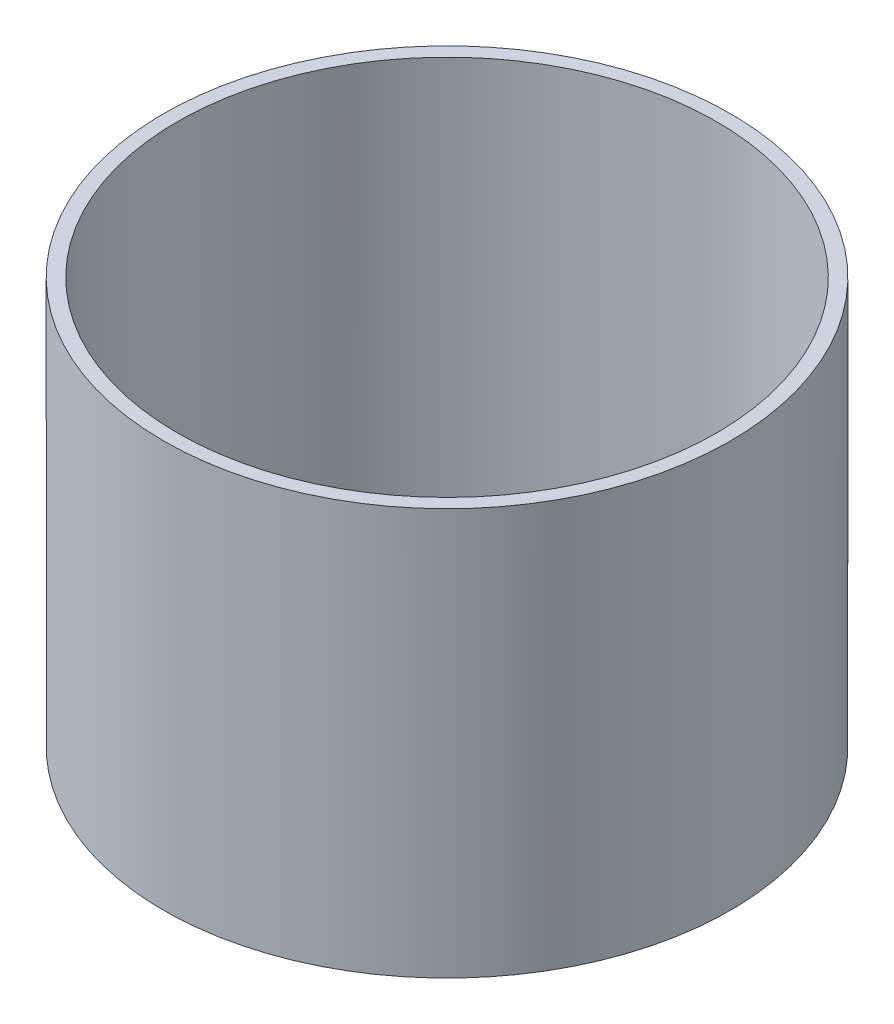
ISO-10303-21;
HEADER;
FILE_DESCRIPTION(('STEP AP214'),'2;1');
FILE_NAME('part.step','',(''),(''),'','','');
FILE_SCHEMA(('AUTOMOTIVE_DESIGN { 1 0 10303 214 1 1 1 1 }'));
ENDSEC;
DATA;
#1=APPLICATION_CONTEXT('core data for automotive mechanical design processes');
#2=APPLICATION_PROTOCOL_DEFINITION('international standard','automotive_design',2000,#1);
#3=PRODUCT_CONTEXT('',#1,'mechanical');
#4=PRODUCT('Part','Part','',(#3));
#5=PRODUCT_RELATED_PRODUCT_CATEGORY('part','',(#4));
#6=PRODUCT_DEFINITION_FORMATION('','',#4);
#7=PRODUCT_DEFINITION_CONTEXT('part definition',#1,'design');
#8=PRODUCT_DEFINITION('design','',#6,#7);
#9=PRODUCT_DEFINITION_SHAPE('','',#8);
#10=(LENGTH_UNIT() NAMED_UNIT(*) SI_UNIT(.MILLI.,.METRE.));
#11=(NAMED_UNIT(*) PLANE_ANGLE_UNIT() SI_UNIT($,.RADIAN.));
#12=(NAMED_UNIT(*) SI_UNIT($,.STERADIAN.) SOLID_ANGLE_UNIT());
#13=UNCERTAINTY_MEASURE_WITH_UNIT(LENGTH_MEASURE(1.E-05),#10,'distance_accuracy_value','');
#14=(GEOMETRIC_REPRESENTATION_CONTEXT(3) GLOBAL_UNCERTAINTY_ASSIGNED_CONTEXT((#13)) GLOBAL_UNIT_ASSIGNED_CONTEXT((#10,
#11,#12)) REPRESENTATION_CONTEXT('',''));
#15=CARTESIAN_POINT('',(0.,0.,0.));
#16=DIRECTION('',(0.,0.,1.));
#17=DIRECTION('',(1.,0.,0.));
#18=AXIS2_PLACEMENT_3D('',#15,#16,#17);
#19=CARTESIAN_POINT('',(0.,58.8,0.));
#20=DIRECTION('',(0.,1.,0.));
#21=DIRECTION('',(0.,0.,1.));
#22=AXIS2_PLACEMENT_3D('',#19,#20,#21);
#23=PLANE('',#22);
#24=CARTESIAN_POINT('',(0.,58.8,0.));
#25=DIRECTION('',(0.,1.,0.));
#26=DIRECTION('',(0.,0.,1.));
#27=AXIS2_PLACEMENT_3D('',#24,#25,#26);
#28=CIRCLE('',#27,41.);
#29=CARTESIAN_POINT('',(0.,58.8,41.));
#30=VERTEX_POINT('',#29);
#31=EDGE_CURVE('E48',#30,#30,#28,.T.);
#32=ORIENTED_EDGE('',*,*,#31,.T.);
#33=EDGE_LOOP('',(#32));
#34=FACE_BOUND('',#33,.T.);
#35=CARTESIAN_POINT('',(0.,58.8,0.));
#36=DIRECTION('',(0.,1.,0.));
#37=DIRECTION('',(0.,0.,1.));
#38=AXIS2_PLACEMENT_3D('',#35,#36,#37);
#39=CIRCLE('',#38,39.);
#40=CARTESIAN_POINT('',(0.,58.8,39.));
#41=VERTEX_POINT('',#40);
#42=EDGE_CURVE('E79',#41,#41,#39,.T.);
#43=ORIENTED_EDGE('',*,*,#42,.F.);
#44=EDGE_LOOP('',(#43));
#45=FACE_BOUND('',#44,.T.);
#46=ADVANCED_FACE('F33',(#34,#45),#23,.T.);
#47=CARTESIAN_POINT('',(0.,0.,0.));
#48=DIRECTION('',(0.,1.,0.));
#49=DIRECTION('',(0.,0.,1.));
#50=AXIS2_PLACEMENT_3D('',#47,#48,#49);
#51=PLANE('',#50);
#52=CARTESIAN_POINT('',(0.,0.,0.));
#53=DIRECTION('',(0.,1.,0.));
#54=DIRECTION('',(0.,0.,1.));
#55=AXIS2_PLACEMENT_3D('',#52,#53,#54);
#56=CIRCLE('',#55,41.);
#57=CARTESIAN_POINT('',(-10.45,0.,-39.645901427512));
#58=VERTEX_POINT('',#57);
#59=CARTESIAN_POINT('',(10.45,0.,-39.645901427512));
#60=VERTEX_POINT('',#59);
#61=EDGE_CURVE('E75',#58,#60,#56,.T.);
#62=ORIENTED_EDGE('',*,*,#61,.F.);
#63=DIRECTION('',(0.,0.,1.));
#64=VECTOR('',#63,1.);
#65=CARTESIAN_POINT('',(-10.45,0.,-41.));
#66=LINE('',#65,#64);
#67=CARTESIAN_POINT('',(-10.45,0.,-37.5738938626275));
#68=VERTEX_POINT('',#67);
#69=EDGE_CURVE('E67',#58,#68,#66,.T.);
#70=ORIENTED_EDGE('',*,*,#69,.T.);
#71=CARTESIAN_POINT('',(0.,0.,0.));
#72=DIRECTION('',(0.,1.,0.));
#73=DIRECTION('',(0.,0.,1.));
#74=AXIS2_PLACEMENT_3D('',#71,#72,#73);
#75=CIRCLE('',#74,39.);
#76=CARTESIAN_POINT('',(10.45,0.,-37.5738938626275));
#77=VERTEX_POINT('',#76);
#78=EDGE_CURVE('E74',#68,#77,#75,.T.);
#79=ORIENTED_EDGE('',*,*,#78,.T.);
#80=DIRECTION('',(0.,0.,1.));
#81=VECTOR('',#80,1.);
#82=CARTESIAN_POINT('',(10.45,0.,-41.));
#83=LINE('',#82,#81);
#84=EDGE_CURVE('E54',#77,#60,#83,.F.);
#85=ORIENTED_EDGE('',*,*,#84,.T.);
#86=EDGE_LOOP('',(#62,#70,#79,#85));
#87=FACE_BOUND('',#86,.T.);
#88=ADVANCED_FACE('F73',(#87),#51,.F.);
#89=CARTESIAN_POINT('',(0.,58.8,0.));
#90=DIRECTION('',(0.,-1.,0.));
#91=DIRECTION('',(0.,0.,-1.));
#92=AXIS2_PLACEMENT_3D('',#89,#90,#91);
#93=CYLINDRICAL_SURFACE('',#92,41.);
#94=ORIENTED_EDGE('',*,*,#31,.F.);
#95=EDGE_LOOP('',(#94));
#96=FACE_BOUND('',#95,.T.);
#97=ORIENTED_EDGE('',*,*,#61,.T.);
#98=CARTESIAN_POINT('',(10.45,0.,-39.645901427512));
#99=CARTESIAN_POINT('',(10.4500368438836,0.288794739504853,-39.6458673603376));
#100=CARTESIAN_POINT('',(10.4380300101083,0.577577541592381,-39.6490558010595));
#101=CARTESIAN_POINT('',(10.3902001444511,1.15297979734717,-39.6616296629602));
#102=CARTESIAN_POINT('',(10.3543812384641,1.43959961709271,-39.6710140105781));
#103=CARTESIAN_POINT('',(10.2592945990659,2.00806170194108,-39.6957067801007));
#104=CARTESIAN_POINT('',(10.2000745031508,2.28991246730492,-39.71100316557));
#105=CARTESIAN_POINT('',(10.0586911320703,2.84744239068655,-39.7470512718942));
#106=CARTESIAN_POINT('',(9.97652751652669,3.12312145707862,-39.7678030736826));
#107=CARTESIAN_POINT('',(9.78994846095404,3.66631352948751,-39.8141448004812));
#108=CARTESIAN_POINT('',(9.6855406114894,3.93382928562062,-39.8397330747708));
#109=CARTESIAN_POINT('',(9.45521632135085,4.45910965438679,-39.8950236129089));
#110=CARTESIAN_POINT('',(9.32929179059307,4.71687055458913,-39.9247274233655));
#111=CARTESIAN_POINT('',(9.05690279276873,5.22082780791828,-39.987398369575));
#112=CARTESIAN_POINT('',(8.91044154116916,5.4670259634021,-40.0203649942267));
#113=CARTESIAN_POINT('',(8.59791187283407,5.94645557162233,-40.088670455776));
#114=CARTESIAN_POINT('',(8.43183448330955,6.17968101809217,-40.1240103750495));
#115=CARTESIAN_POINT('',(8.07763531389647,6.63622477342002,-40.196830133563));
#116=CARTESIAN_POINT('',(7.88913164319508,6.85924226061073,-40.234338979343));
#117=CARTESIAN_POINT('',(7.49425670673087,7.28859725251964,-40.3097567874696));
#118=CARTESIAN_POINT('',(7.28789316603187,7.49494189492715,-40.3476655706594));
#119=CARTESIAN_POINT('',(6.8584514481281,7.8898211544875,-40.4228793953211));
#120=CARTESIAN_POINT('',(6.63536381707103,8.07834555993972,-40.4601840805966));
#121=CARTESIAN_POINT('',(6.174110381416,8.43611388535035,-40.5331327472467));
#122=CARTESIAN_POINT('',(5.93595027730379,8.60536502755768,-40.5687773477242));
#123=CARTESIAN_POINT('',(5.44240328793721,8.92583825734205,-40.6379531803324));
#124=CARTESIAN_POINT('',(5.18681396053993,9.07675722826524,-40.6714454351166));
#125=CARTESIAN_POINT('',(4.66336344310647,9.35647377220445,-40.7347828592638));
#126=CARTESIAN_POINT('',(4.39550209647532,9.48527106284097,-40.7646279820703));
#127=CARTESIAN_POINT('',(3.84942935533693,9.71970499441874,-40.8198135830379));
#128=CARTESIAN_POINT('',(3.57121970225033,9.82534551175852,-40.8451548150069));
#129=CARTESIAN_POINT('',(3.00641768536695,10.012615230145,-40.8906065529402));
#130=CARTESIAN_POINT('',(2.71982552510235,10.0942450136552,-40.9107171857892));
#131=CARTESIAN_POINT('',(2.14647395602521,10.231334152,-40.9447601292532));
#132=CARTESIAN_POINT('',(1.85984450341102,10.2873071930013,-40.9588133406824));
#133=CARTESIAN_POINT('',(1.28267980982847,10.3750871731124,-40.9809483195822));
#134=CARTESIAN_POINT('',(0.992144618224661,10.4068944173614,-40.9890301624527));
#135=CARTESIAN_POINT('',(0.409357337753068,10.4460620221573,-40.9989920863706));
#136=CARTESIAN_POINT('',(0.117105443856216,10.4534251071059,-41.0008728585527));
#137=CARTESIAN_POINT('',(-0.466959268206286,10.4436465131394,-40.9983808106222));
#138=CARTESIAN_POINT('',(-0.758772092001787,10.4265051511527,-40.9940080713895));
#139=CARTESIAN_POINT('',(-1.33306338718485,10.3685488176112,-40.9793062984528));
#140=CARTESIAN_POINT('',(-1.61560176819125,10.3282898513571,-40.9691171880145));
#141=CARTESIAN_POINT('',(-2.17618838022974,10.2248687251339,-40.9431671621998));
#142=CARTESIAN_POINT('',(-2.45423669213014,10.1617069781366,-40.9274063472897));
#143=CARTESIAN_POINT('',(-3.0039335559681,10.0129894890805,-40.8907357580868));
#144=CARTESIAN_POINT('',(-3.27558195151648,9.92743320040326,-40.8698258581128));
#145=CARTESIAN_POINT('',(-3.81064880176692,9.73459451067779,-40.8234133585548));
#146=CARTESIAN_POINT('',(-4.07406713611667,9.62731179208457,-40.7979106918452));
#147=CARTESIAN_POINT('',(-4.5933095680797,9.39074772505925,-40.7427330805346));
#148=CARTESIAN_POINT('',(-4.84904243538839,9.26127457338186,-40.7130221876318));
#149=CARTESIAN_POINT('',(-5.34880281689806,8.98191462758621,-40.6503845271063));
#150=CARTESIAN_POINT('',(-5.59282624526164,8.83202077700494,-40.6174566489577));
#151=CARTESIAN_POINT('',(-6.06752137923255,8.51290047610375,-40.5492624752319));
#152=CARTESIAN_POINT('',(-6.29819367604059,8.34367488279993,-40.513996283346));
#153=CARTESIAN_POINT('',(-6.74476459762285,7.9870091038446,-40.4420488243379));
#154=CARTESIAN_POINT('',(-6.96066291731456,7.79956854224746,-40.4053675280182));
#155=CARTESIAN_POINT('',(-7.38220696633468,7.40214676103632,-40.3305112330858));
#156=CARTESIAN_POINT('',(-7.58739198178297,7.19167900854678,-40.2923232799351));
#157=CARTESIAN_POINT('',(-7.97929785420183,6.75422245235297,-40.2165468372802));
#158=CARTESIAN_POINT('',(-8.16602433951858,6.52723872155191,-40.1789581679935));
#159=CARTESIAN_POINT('',(-8.51989710492812,6.05807118987121,-40.1054115787501));
#160=CARTESIAN_POINT('',(-8.68703438068663,5.81588047692188,-40.0694544133447));
#161=CARTESIAN_POINT('',(-9.00044097122405,5.31799646131141,-40.0002228413847));
#162=CARTESIAN_POINT('',(-9.14671094345448,5.06230358440142,-39.9669483503232));
#163=CARTESIAN_POINT('',(-9.4180919156905,4.53759733709806,-39.9038729525829));
#164=CARTESIAN_POINT('',(-9.54307485926259,4.26851512195719,-39.8740933819395));
#165=CARTESIAN_POINT('',(-9.76984382352378,3.72030030667032,-39.8191382753024));
#166=CARTESIAN_POINT('',(-9.87163087619826,3.44116815428618,-39.793962534494));
#167=CARTESIAN_POINT('',(-10.0510573661208,2.87519894444637,-39.749022657032));
#168=CARTESIAN_POINT('',(-10.1287260750808,2.58837168949553,-39.7292519639487));
#169=CARTESIAN_POINT('',(-10.2593799182673,2.00892469359058,-39.695713469014));
#170=CARTESIAN_POINT('',(-10.3123765990126,1.71630772920302,-39.681942859315));
#171=CARTESIAN_POINT('',(-10.3851732873343,1.18626933136262,-39.6629465784739));
#172=CARTESIAN_POINT('',(-10.4094899513117,0.949499010206785,-39.6565634554929));
#173=CARTESIAN_POINT('',(-10.4418972787809,0.475159015192538,-39.6480369867694));
#174=CARTESIAN_POINT('',(-10.4500140403579,0.237591245628837,-39.6458868217967));
#175=CARTESIAN_POINT('',(-10.45,0.,-39.645901427512));
#176=B_SPLINE_CURVE_WITH_KNOTS('',3,(#98,#99,#100,#101,#102,#103,#104,#105,#106,#107,#108,#109,
#110,#111,#112,#113,#114,#115,#116,#117,#118,#119,#120,#121,#122,#123,#124,#125,#126,#127,#128,
#129,#130,#131,#132,#133,#134,#135,#136,#137,#138,#139,#140,#141,#142,#143,#144,#145,#146,#147,
#148,#149,#150,#151,#152,#153,#154,#155,#156,#157,#158,#159,#160,#161,#162,#163,#164,#165,#166,
#167,#168,#169,#170,#171,#172,#173,#174,#175),.UNSPECIFIED.,.F.,.F.,(4,2,2,2,2,2,2,2,2,2,2,2,2,
2,2,2,2,2,2,2,2,2,2,2,2,2,2,2,2,2,2,2,2,2,2,2,2,2,4),(0.,0.866098913349945,1.7320477976716,
2.59624288810411,3.46045079997393,4.32436428277422,5.18860330713596,6.05270716700358,
6.91720782612631,7.7994179740568,8.68124842208141,9.5635811686911,10.4455821840423,
11.340606711544,12.2356426630338,13.1305286726455,14.0253929719091,14.9014609538454,
15.7775178735677,16.653477149878,17.5294250970688,18.3851387140813,19.2408369020506,
20.0965559783279,20.9522875623638,21.8158276420485,22.6796668823168,23.5434678416574,
24.407286633101,25.295461257298,26.1833642198615,27.0716737265295,27.959955239668,
28.853404868785,29.7468147405574,30.6391360308962,31.531039293664,32.2447706514485,
32.9573512550355),.UNSPECIFIED.);
#177=EDGE_CURVE('E60',#60,#58,#176,.T.);
#178=ORIENTED_EDGE('',*,*,#177,.T.);
#179=EDGE_LOOP('',(#97,#178));
#180=FACE_BOUND('',#179,.T.);
#181=ADVANCED_FACE('F35',(#96,#180),#93,.T.);
#182=CARTESIAN_POINT('',(0.,58.8,0.));
#183=DIRECTION('',(0.,-1.,0.));
#184=DIRECTION('',(0.,0.,-1.));
#185=AXIS2_PLACEMENT_3D('',#182,#183,#184);
#186=CYLINDRICAL_SURFACE('',#185,39.);
#187=CARTESIAN_POINT('',(10.45,0.,-37.5738938626275));
#188=CARTESIAN_POINT('',(10.4500373920709,0.28825089165381,-37.5738577903348));
#189=CARTESIAN_POINT('',(10.4380750900914,0.576489026360343,-37.5772096511429));
#190=CARTESIAN_POINT('',(10.3904267658209,1.15079511939878,-37.5904264048467));
#191=CARTESIAN_POINT('',(10.3547451827669,1.43686347369008,-37.6002900790066));
#192=CARTESIAN_POINT('',(10.2600363187395,2.00418052141009,-37.6262397112694));
#193=CARTESIAN_POINT('',(10.201059704351,2.285438301817,-37.6423121636508));
#194=CARTESIAN_POINT('',(10.0602723818592,2.84178532232935,-37.6801839589875));
#195=CARTESIAN_POINT('',(9.97846126571851,3.11687445211022,-37.70198340428));
#196=CARTESIAN_POINT('',(9.79270803170171,3.65888119732499,-37.7506564741922));
#197=CARTESIAN_POINT('',(9.68877496871096,3.92580210517521,-37.7775280222069));
#198=CARTESIAN_POINT('',(9.45952074738847,4.44992300861089,-37.8355844066197));
#199=CARTESIAN_POINT('',(9.33419153799919,4.70711930030303,-37.8667708658155));
#200=CARTESIAN_POINT('',(9.06310545558156,5.21001049266284,-37.9325659606546));
#201=CARTESIAN_POINT('',(8.91735082992566,5.45570665470729,-37.9671742196801));
#202=CARTESIAN_POINT('',(8.60634446947611,5.93420568358139,-38.0388788488303));
#203=CARTESIAN_POINT('',(8.44108380251954,6.16700257134461,-38.0759763554443));
#204=CARTESIAN_POINT('',(8.08825192538371,6.62327115800854,-38.1525030749824));
#205=CARTESIAN_POINT('',(7.90025993568541,6.84641190540535,-38.1919660792141));
#206=CARTESIAN_POINT('',(7.50641503261476,7.27606544223906,-38.2713216243548));
#207=CARTESIAN_POINT('',(7.30056979761296,7.48258530707192,-38.3112139742069));
#208=CARTESIAN_POINT('',(6.87215594529444,7.8778783918601,-38.390375612173));
#209=CARTESIAN_POINT('',(6.6495778480358,8.06664141332349,-38.4296445315929));
#210=CARTESIAN_POINT('',(6.18931626576442,8.42495638514409,-38.5064510149797));
#211=CARTESIAN_POINT('',(5.95163849108334,8.59451553122689,-38.5439892242997));
#212=CARTESIAN_POINT('',(5.45861259014551,8.91594400224213,-38.6169217750298));
#213=CARTESIAN_POINT('',(5.20303841137456,9.06747717463839,-38.6522707976042));
#214=CARTESIAN_POINT('',(4.6795159575024,9.3484159382728,-38.7191394205522));
#215=CARTESIAN_POINT('',(4.41156750690842,9.47782121556915,-38.7506589665928));
#216=CARTESIAN_POINT('',(3.86521809590414,9.7134481559694,-38.808962101489));
#217=CARTESIAN_POINT('',(3.58681901320603,9.81967396068696,-38.8357465362324));
#218=CARTESIAN_POINT('',(3.02153667696182,10.0080751569658,-38.883811073634));
#219=CARTESIAN_POINT('',(2.73465365221985,10.0902511964771,-38.9050913245845));
#220=CARTESIAN_POINT('',(2.16124596868057,10.2282185858896,-38.941104548425));
#221=CARTESIAN_POINT('',(1.87486615676168,10.2845756448168,-38.9559774259799));
#222=CARTESIAN_POINT('',(1.29814345111737,10.3731592268587,-38.9794574546225));
#223=CARTESIAN_POINT('',(1.00780061256513,10.4053860855653,-38.9880646928499));
#224=CARTESIAN_POINT('',(0.425352780422654,10.4454189673224,-38.9987679865144));
#225=CARTESIAN_POINT('',(0.133248011649204,10.4532280426176,-39.0008648557534));
#226=CARTESIAN_POINT('',(-0.450560700083243,10.4443630304666,-38.998489709896));
#227=CARTESIAN_POINT('',(-0.74226464874783,10.4276892952188,-38.9940177892952));
#228=CARTESIAN_POINT('',(-1.31566789482434,10.370747394751,-38.9788298426001));
#229=CARTESIAN_POINT('',(-1.59743259409284,10.3310919114221,-38.9682759972049));
#230=CARTESIAN_POINT('',(-2.15651625867978,10.2290118823536,-38.9413374533237));
#231=CARTESIAN_POINT('',(-2.43383531249339,10.1665877904357,-38.9249528710555));
#232=CARTESIAN_POINT('',(-2.98212785740405,10.0194802502734,-38.8867900921682));
#233=CARTESIAN_POINT('',(-3.25310118877777,9.93479624239601,-38.8650117599465));
#234=CARTESIAN_POINT('',(-3.7868852975127,9.74383659306699,-38.8166372330642));
#235=CARTESIAN_POINT('',(-4.04969594535907,9.63756060922349,-38.7900409620044));
#236=CARTESIAN_POINT('',(-4.56798278338126,9.40307018601267,-38.7324436470119));
#237=CARTESIAN_POINT('',(-4.82336153066072,9.27465044023831,-38.701401889635));
#238=CARTESIAN_POINT('',(-5.32250249464289,8.99749894597405,-38.6359205568874));
#239=CARTESIAN_POINT('',(-5.56626065995522,8.84876018233656,-38.6014798091589));
#240=CARTESIAN_POINT('',(-6.04053849063783,8.53203995685065,-38.5301104349061));
#241=CARTESIAN_POINT('',(-6.27105853042812,8.36405903963977,-38.4931818788099));
#242=CARTESIAN_POINT('',(-6.71745548670718,8.00996012569933,-38.4177959048086));
#243=CARTESIAN_POINT('',(-6.93333206692629,7.8238417127027,-38.3793384518264));
#244=CARTESIAN_POINT('',(-7.35558499466213,7.42859833142493,-38.3006908440009));
#245=CARTESIAN_POINT('',(-7.56145753374542,7.21893809771128,-38.2604839857264));
#246=CARTESIAN_POINT('',(-7.95481086713835,6.7830408666478,-38.1806398607475));
#247=CARTESIAN_POINT('',(-8.14229722347866,6.55680891883457,-38.1410024249026));
#248=CARTESIAN_POINT('',(-8.4977668149349,6.08907060039109,-38.0633824155202));
#249=CARTESIAN_POINT('',(-8.66574103542037,5.84755724869965,-38.0254006119094));
#250=CARTESIAN_POINT('',(-8.98089619917668,5.3509334670487,-37.9522026295156));
#251=CARTESIAN_POINT('',(-9.12807778870539,5.09582346002779,-37.9169863647916));
#252=CARTESIAN_POINT('',(-9.4015000305453,4.57189343203844,-37.8501222440888));
#253=CARTESIAN_POINT('',(-9.52758948951678,4.30299109374411,-37.8185006326935));
#254=CARTESIAN_POINT('',(-9.75657435446192,3.75498786125636,-37.7600745381941));
#255=CARTESIAN_POINT('',(-9.85947084864728,3.47588744627009,-37.7332698290934));
#256=CARTESIAN_POINT('',(-10.0410966710383,2.90983197479665,-37.6853446660831));
#257=CARTESIAN_POINT('',(-10.11985535131,2.62288692397831,-37.66421731228));
#258=CARTESIAN_POINT('',(-10.2526483430768,2.04306348836096,-37.6282862538017));
#259=CARTESIAN_POINT('',(-10.3066941730884,1.75018793434513,-37.6134796032975));
#260=CARTESIAN_POINT('',(-10.3820563744742,1.21435937375334,-37.5927411611194));
#261=CARTESIAN_POINT('',(-10.407540555675,0.972027158982297,-37.5856842636542));
#262=CARTESIAN_POINT('',(-10.4415070574466,0.486469841542505,-37.5762556688693));
#263=CARTESIAN_POINT('',(-10.4500162129729,0.243246758088793,-37.5738765767309));
#264=CARTESIAN_POINT('',(-10.45,0.,-37.5738938626275));
#265=B_SPLINE_CURVE_WITH_KNOTS('',3,(#187,#188,#189,#190,#191,#192,#193,#194,#195,#196,#197,
#198,#199,#200,#201,#202,#203,#204,#205,#206,#207,#208,#209,#210,#211,#212,#213,#214,#215,#216,
#217,#218,#219,#220,#221,#222,#223,#224,#225,#226,#227,#228,#229,#230,#231,#232,#233,#234,#235,
#236,#237,#238,#239,#240,#241,#242,#243,#244,#245,#246,#247,#248,#249,#250,#251,#252,#253,#254,
#255,#256,#257,#258,#259,#260,#261,#262,#263,#264),.UNSPECIFIED.,.F.,.F.,(4,2,2,2,2,2,2,2,2,2,2,
2,2,2,2,2,2,2,2,2,2,2,2,2,2,2,2,2,2,2,2,2,2,2,2,2,2,2,4),(0.,0.864465553647065,1.72876936177971,
2.59120357406108,3.45365319845301,4.31575048423306,5.17817288253661,6.04050046442321,
6.90322446468157,7.78550244376317,8.66740283439857,9.54980668343005,10.4318787926017,
11.3284333784159,12.2250006831362,13.1214076614545,14.0177904865056,14.8934639851426,
15.7691253050808,16.6446771621952,17.5202164241502,18.3734229223376,19.2266124154238,
20.0798233604584,20.9330478362271,21.7946561007941,22.6565625912542,23.5184446919972,
24.3803465781431,25.2690368140743,26.1574573763287,27.0462867710988,27.9350885339921,
28.8300111715943,29.7248918107669,30.6186798995133,31.5120509730948,32.2427420988202,
32.9722771938147),.UNSPECIFIED.);
#266=EDGE_CURVE('E11',#77,#68,#265,.T.);
#267=ORIENTED_EDGE('',*,*,#266,.F.);
#268=ORIENTED_EDGE('',*,*,#78,.F.);
#269=EDGE_LOOP('',(#267,#268));
#270=FACE_BOUND('',#269,.T.);
#271=ORIENTED_EDGE('',*,*,#42,.T.);
#272=EDGE_LOOP('',(#271));
#273=FACE_BOUND('',#272,.T.);
#274=ADVANCED_FACE('F77',(#270,#273),#186,.F.);
#275=CARTESIAN_POINT('',(0.,0.,-41.));
#276=DIRECTION('',(0.,0.,1.));
#277=DIRECTION('',(1.,0.,0.));
#278=AXIS2_PLACEMENT_3D('',#275,#276,#277);
#279=CYLINDRICAL_SURFACE('',#278,10.45);
#280=ORIENTED_EDGE('',*,*,#84,.F.);
#281=ORIENTED_EDGE('',*,*,#266,.T.);
#282=ORIENTED_EDGE('',*,*,#69,.F.);
#283=ORIENTED_EDGE('',*,*,#177,.F.);
#284=EDGE_LOOP('',(#280,#281,#282,#283));
#285=FACE_BOUND('',#284,.T.);
#286=ADVANCED_FACE('F66',(#285),#279,.F.);
#287=CLOSED_SHELL('',(#46,#88,#181,#274,#286));
#288=MANIFOLD_SOLID_BREP('B2',#287);
#289=ADVANCED_BREP_SHAPE_REPRESENTATION('',(#18,#288),#14);
#290=SHAPE_DEFINITION_REPRESENTATION(#9,#289);
ENDSEC;
END-ISO-10303-21;
